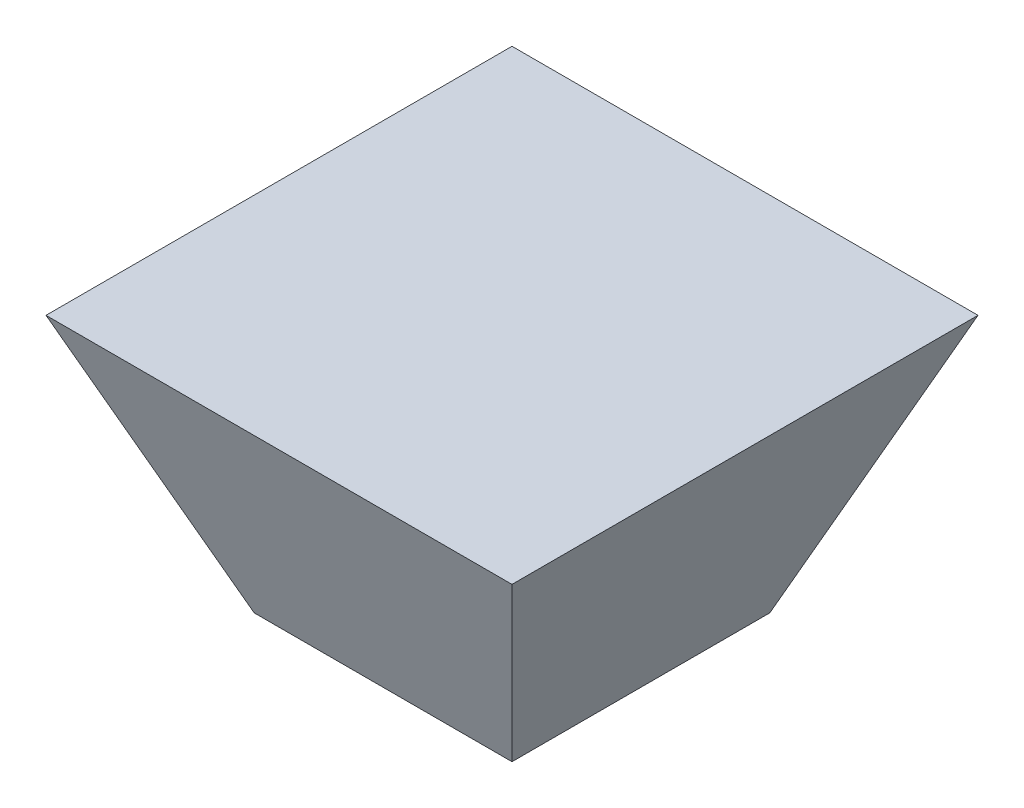
ISO-10303-21;
HEADER;
FILE_DESCRIPTION(('STEP AP214'),'2;1');
FILE_NAME('part.step','',(''),(''),'','','');
FILE_SCHEMA(('AUTOMOTIVE_DESIGN { 1 0 10303 214 1 1 1 1 }'));
ENDSEC;
DATA;
#1=APPLICATION_CONTEXT('core data for automotive mechanical design processes');
#2=APPLICATION_PROTOCOL_DEFINITION('international standard','automotive_design',2000,#1);
#3=PRODUCT_CONTEXT('',#1,'mechanical');
#4=PRODUCT('Part','Part','',(#3));
#5=PRODUCT_RELATED_PRODUCT_CATEGORY('part','',(#4));
#6=PRODUCT_DEFINITION_FORMATION('','',#4);
#7=PRODUCT_DEFINITION_CONTEXT('part definition',#1,'design');
#8=PRODUCT_DEFINITION('design','',#6,#7);
#9=PRODUCT_DEFINITION_SHAPE('','',#8);
#10=(LENGTH_UNIT() NAMED_UNIT(*) SI_UNIT(.MILLI.,.METRE.));
#11=(NAMED_UNIT(*) PLANE_ANGLE_UNIT() SI_UNIT($,.RADIAN.));
#12=(NAMED_UNIT(*) SI_UNIT($,.STERADIAN.) SOLID_ANGLE_UNIT());
#13=UNCERTAINTY_MEASURE_WITH_UNIT(LENGTH_MEASURE(1.E-05),#10,'distance_accuracy_value','');
#14=(GEOMETRIC_REPRESENTATION_CONTEXT(3) GLOBAL_UNCERTAINTY_ASSIGNED_CONTEXT((#13)) GLOBAL_UNIT_ASSIGNED_CONTEXT((#10,
#11,#12)) REPRESENTATION_CONTEXT('',''));
#15=CARTESIAN_POINT('',(0.,0.,0.));
#16=DIRECTION('',(0.,0.,1.));
#17=DIRECTION('',(1.,0.,0.));
#18=AXIS2_PLACEMENT_3D('',#15,#16,#17);
#19=CARTESIAN_POINT('',(-56.35,0.,56.35));
#20=DIRECTION('',(0.,-0.374606593415913,0.927183854566787));
#21=DIRECTION('',(0.,-0.927183854566787,-0.374606593415913));
#22=AXIS2_PLACEMENT_3D('',#19,#20,#21);
#23=PLANE('',#22);
#24=DIRECTION('',(1.,0.,0.));
#25=VECTOR('',#24,1.);
#26=CARTESIAN_POINT('',(-56.35,0.,56.35));
#27=LINE('',#26,#25);
#28=CARTESIAN_POINT('',(-56.35,0.,56.35));
#29=VERTEX_POINT('',#28);
#30=CARTESIAN_POINT('',(56.35,0.,56.35));
#31=VERTEX_POINT('',#30);
#32=EDGE_CURVE('E90',#29,#31,#27,.T.);
#33=ORIENTED_EDGE('',*,*,#32,.T.);
#34=DIRECTION('',(-0.350800434887317,-0.868261544562316,-0.350800434887317));
#35=VECTOR('',#34,1.);
#36=CARTESIAN_POINT('',(56.35,0.,56.35));
#37=LINE('',#36,#35);
#38=CARTESIAN_POINT('',(101.883755651622,112.7,101.883755651622));
#39=VERTEX_POINT('',#38);
#40=EDGE_CURVE('E11',#39,#31,#37,.T.);
#41=ORIENTED_EDGE('',*,*,#40,.F.);
#42=DIRECTION('',(-1.,0.,0.));
#43=VECTOR('',#42,1.);
#44=CARTESIAN_POINT('',(-56.35,112.7,101.883755651622));
#45=LINE('',#44,#43);
#46=CARTESIAN_POINT('',(-101.883755651622,112.7,101.883755651622));
#47=VERTEX_POINT('',#46);
#48=EDGE_CURVE('E110',#47,#39,#45,.F.);
#49=ORIENTED_EDGE('',*,*,#48,.F.);
#50=DIRECTION('',(0.350800434887317,-0.868261544562316,-0.350800434887317));
#51=VECTOR('',#50,1.);
#52=CARTESIAN_POINT('',(-56.35,0.,56.35));
#53=LINE('',#52,#51);
#54=EDGE_CURVE('E102',#47,#29,#53,.T.);
#55=ORIENTED_EDGE('',*,*,#54,.T.);
#56=EDGE_LOOP('',(#33,#41,#49,#55));
#57=FACE_BOUND('',#56,.T.);
#58=ADVANCED_FACE('F43',(#57),#23,.T.);
#59=CARTESIAN_POINT('',(56.35,0.,56.35));
#60=DIRECTION('',(0.927183854566787,-0.374606593415913,0.));
#61=DIRECTION('',(0.374606593415913,0.927183854566787,0.));
#62=AXIS2_PLACEMENT_3D('',#59,#60,#61);
#63=PLANE('',#62);
#64=DIRECTION('',(0.,0.,-1.));
#65=VECTOR('',#64,1.);
#66=CARTESIAN_POINT('',(56.35,0.,56.35));
#67=LINE('',#66,#65);
#68=CARTESIAN_POINT('',(56.35,0.,-56.35));
#69=VERTEX_POINT('',#68);
#70=EDGE_CURVE('E86',#31,#69,#67,.T.);
#71=ORIENTED_EDGE('',*,*,#70,.T.);
#72=DIRECTION('',(-0.350800434887317,-0.868261544562316,0.350800434887317));
#73=VECTOR('',#72,1.);
#74=CARTESIAN_POINT('',(56.35,0.,-56.35));
#75=LINE('',#74,#73);
#76=CARTESIAN_POINT('',(101.883755651622,112.7,-101.883755651622));
#77=VERTEX_POINT('',#76);
#78=EDGE_CURVE('E53',#77,#69,#75,.T.);
#79=ORIENTED_EDGE('',*,*,#78,.F.);
#80=DIRECTION('',(0.,0.,1.));
#81=VECTOR('',#80,1.);
#82=CARTESIAN_POINT('',(101.883755651622,112.7,56.35));
#83=LINE('',#82,#81);
#84=EDGE_CURVE('E98',#39,#77,#83,.F.);
#85=ORIENTED_EDGE('',*,*,#84,.F.);
#86=ORIENTED_EDGE('',*,*,#40,.T.);
#87=EDGE_LOOP('',(#71,#79,#85,#86));
#88=FACE_BOUND('',#87,.T.);
#89=ADVANCED_FACE('F45',(#88),#63,.T.);
#90=CARTESIAN_POINT('',(56.35,0.,-56.35));
#91=DIRECTION('',(0.,-0.374606593415913,-0.927183854566787));
#92=DIRECTION('',(0.,0.927183854566787,-0.374606593415913));
#93=AXIS2_PLACEMENT_3D('',#90,#91,#92);
#94=PLANE('',#93);
#95=DIRECTION('',(-1.,0.,0.));
#96=VECTOR('',#95,1.);
#97=CARTESIAN_POINT('',(56.35,0.,-56.35));
#98=LINE('',#97,#96);
#99=CARTESIAN_POINT('',(-56.35,0.,-56.35));
#100=VERTEX_POINT('',#99);
#101=EDGE_CURVE('E91',#69,#100,#98,.T.);
#102=ORIENTED_EDGE('',*,*,#101,.T.);
#103=DIRECTION('',(0.350800434887317,-0.868261544562316,0.350800434887317));
#104=VECTOR('',#103,1.);
#105=CARTESIAN_POINT('',(-56.35,0.,-56.35));
#106=LINE('',#105,#104);
#107=CARTESIAN_POINT('',(-101.883755651622,112.7,-101.883755651622));
#108=VERTEX_POINT('',#107);
#109=EDGE_CURVE('E114',#108,#100,#106,.T.);
#110=ORIENTED_EDGE('',*,*,#109,.F.);
#111=DIRECTION('',(1.,0.,0.));
#112=VECTOR('',#111,1.);
#113=CARTESIAN_POINT('',(56.35,112.7,-101.883755651622));
#114=LINE('',#113,#112);
#115=EDGE_CURVE('E65',#77,#108,#114,.F.);
#116=ORIENTED_EDGE('',*,*,#115,.F.);
#117=ORIENTED_EDGE('',*,*,#78,.T.);
#118=EDGE_LOOP('',(#102,#110,#116,#117));
#119=FACE_BOUND('',#118,.T.);
#120=ADVANCED_FACE('F127',(#119),#94,.T.);
#121=CARTESIAN_POINT('',(-56.35,0.,-56.35));
#122=DIRECTION('',(-0.927183854566787,-0.374606593415913,0.));
#123=DIRECTION('',(0.374606593415913,-0.927183854566787,0.));
#124=AXIS2_PLACEMENT_3D('',#121,#122,#123);
#125=PLANE('',#124);
#126=DIRECTION('',(0.,0.,1.));
#127=VECTOR('',#126,1.);
#128=CARTESIAN_POINT('',(-56.35,0.,-56.35));
#129=LINE('',#128,#127);
#130=EDGE_CURVE('E108',#100,#29,#129,.T.);
#131=ORIENTED_EDGE('',*,*,#130,.T.);
#132=ORIENTED_EDGE('',*,*,#54,.F.);
#133=DIRECTION('',(0.,0.,-1.));
#134=VECTOR('',#133,1.);
#135=CARTESIAN_POINT('',(-101.883755651622,112.7,-56.35));
#136=LINE('',#135,#134);
#137=EDGE_CURVE('E47',#108,#47,#136,.F.);
#138=ORIENTED_EDGE('',*,*,#137,.F.);
#139=ORIENTED_EDGE('',*,*,#109,.T.);
#140=EDGE_LOOP('',(#131,#132,#138,#139));
#141=FACE_BOUND('',#140,.T.);
#142=ADVANCED_FACE('F129',(#141),#125,.T.);
#143=CARTESIAN_POINT('',(0.,112.7,0.));
#144=DIRECTION('',(0.,1.,0.));
#145=DIRECTION('',(0.,0.,1.));
#146=AXIS2_PLACEMENT_3D('',#143,#144,#145);
#147=PLANE('',#146);
#148=ORIENTED_EDGE('',*,*,#48,.T.);
#149=ORIENTED_EDGE('',*,*,#84,.T.);
#150=ORIENTED_EDGE('',*,*,#115,.T.);
#151=ORIENTED_EDGE('',*,*,#137,.T.);
#152=EDGE_LOOP('',(#148,#149,#150,#151));
#153=FACE_BOUND('',#152,.T.);
#154=ADVANCED_FACE('F125',(#153),#147,.T.);
#155=CARTESIAN_POINT('',(0.,0.,0.));
#156=DIRECTION('',(0.,1.,0.));
#157=DIRECTION('',(0.,0.,1.));
#158=AXIS2_PLACEMENT_3D('',#155,#156,#157);
#159=PLANE('',#158);
#160=ORIENTED_EDGE('',*,*,#32,.F.);
#161=ORIENTED_EDGE('',*,*,#130,.F.);
#162=ORIENTED_EDGE('',*,*,#101,.F.);
#163=ORIENTED_EDGE('',*,*,#70,.F.);
#164=EDGE_LOOP('',(#160,#161,#162,#163));
#165=FACE_BOUND('',#164,.T.);
#166=ADVANCED_FACE('F87',(#165),#159,.F.);
#167=CLOSED_SHELL('',(#58,#89,#120,#142,#154,#166));
#168=MANIFOLD_SOLID_BREP('B2',#167);
#169=ADVANCED_BREP_SHAPE_REPRESENTATION('',(#18,#168),#14);
#170=SHAPE_DEFINITION_REPRESENTATION(#9,#169);
ENDSEC;
END-ISO-10303-21;
